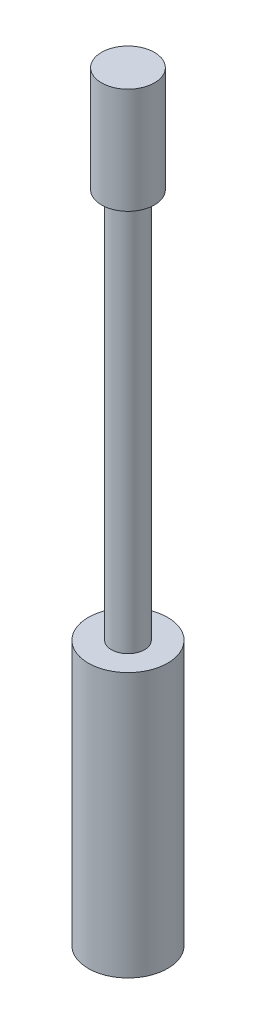
ISO-10303-21;
HEADER;
FILE_DESCRIPTION(('STEP AP214'),'2;1');
FILE_NAME('part.step','',(''),(''),'','','');
FILE_SCHEMA(('AUTOMOTIVE_DESIGN { 1 0 10303 214 1 1 1 1 }'));
ENDSEC;
DATA;
#1=APPLICATION_CONTEXT('core data for automotive mechanical design processes');
#2=APPLICATION_PROTOCOL_DEFINITION('international standard','automotive_design',2000,#1);
#3=PRODUCT_CONTEXT('',#1,'mechanical');
#4=PRODUCT('Part','Part','',(#3));
#5=PRODUCT_RELATED_PRODUCT_CATEGORY('part','',(#4));
#6=PRODUCT_DEFINITION_FORMATION('','',#4);
#7=PRODUCT_DEFINITION_CONTEXT('part definition',#1,'design');
#8=PRODUCT_DEFINITION('design','',#6,#7);
#9=PRODUCT_DEFINITION_SHAPE('','',#8);
#10=(LENGTH_UNIT() NAMED_UNIT(*) SI_UNIT(.MILLI.,.METRE.));
#11=(NAMED_UNIT(*) PLANE_ANGLE_UNIT() SI_UNIT($,.RADIAN.));
#12=(NAMED_UNIT(*) SI_UNIT($,.STERADIAN.) SOLID_ANGLE_UNIT());
#13=UNCERTAINTY_MEASURE_WITH_UNIT(LENGTH_MEASURE(1.E-05),#10,'distance_accuracy_value','');
#14=(GEOMETRIC_REPRESENTATION_CONTEXT(3) GLOBAL_UNCERTAINTY_ASSIGNED_CONTEXT((#13)) GLOBAL_UNIT_ASSIGNED_CONTEXT((#10,
#11,#12)) REPRESENTATION_CONTEXT('',''));
#15=CARTESIAN_POINT('',(0.,0.,0.));
#16=DIRECTION('',(0.,0.,1.));
#17=DIRECTION('',(1.,0.,0.));
#18=AXIS2_PLACEMENT_3D('',#15,#16,#17);
#19=CARTESIAN_POINT('',(0.,40.,0.));
#20=DIRECTION('',(0.,-1.,0.));
#21=DIRECTION('',(0.,0.,-1.));
#22=AXIS2_PLACEMENT_3D('',#19,#20,#21);
#23=CYLINDRICAL_SURFACE('',#22,6.);
#24=CARTESIAN_POINT('',(0.,40.,0.));
#25=DIRECTION('',(0.,1.,0.));
#26=DIRECTION('',(0.,0.,1.));
#27=AXIS2_PLACEMENT_3D('',#24,#25,#26);
#28=CIRCLE('',#27,6.);
#29=CARTESIAN_POINT('',(0.,40.,6.));
#30=VERTEX_POINT('',#29);
#31=EDGE_CURVE('E10',#30,#30,#28,.T.);
#32=ORIENTED_EDGE('',*,*,#31,.F.);
#33=EDGE_LOOP('',(#32));
#34=FACE_BOUND('',#33,.T.);
#35=CARTESIAN_POINT('',(0.,0.,0.));
#36=DIRECTION('',(0.,1.,0.));
#37=DIRECTION('',(0.,0.,1.));
#38=AXIS2_PLACEMENT_3D('',#35,#36,#37);
#39=CIRCLE('',#38,6.);
#40=CARTESIAN_POINT('',(0.,0.,6.));
#41=VERTEX_POINT('',#40);
#42=EDGE_CURVE('E33',#41,#41,#39,.T.);
#43=ORIENTED_EDGE('',*,*,#42,.T.);
#44=EDGE_LOOP('',(#43));
#45=FACE_BOUND('',#44,.T.);
#46=ADVANCED_FACE('F30',(#34,#45),#23,.T.);
#47=CARTESIAN_POINT('',(0.,40.,0.));
#48=DIRECTION('',(0.,1.,0.));
#49=DIRECTION('',(0.,0.,1.));
#50=AXIS2_PLACEMENT_3D('',#47,#48,#49);
#51=PLANE('',#50);
#52=CARTESIAN_POINT('',(0.,40.,0.));
#53=DIRECTION('',(0.,1.,0.));
#54=DIRECTION('',(0.,0.,1.));
#55=AXIS2_PLACEMENT_3D('',#52,#53,#54);
#56=CIRCLE('',#55,2.5);
#57=CARTESIAN_POINT('',(0.,40.,2.5));
#58=VERTEX_POINT('',#57);
#59=EDGE_CURVE('E42',#58,#58,#56,.T.);
#60=ORIENTED_EDGE('',*,*,#59,.F.);
#61=EDGE_LOOP('',(#60));
#62=FACE_BOUND('',#61,.T.);
#63=ORIENTED_EDGE('',*,*,#31,.T.);
#64=EDGE_LOOP('',(#63));
#65=FACE_BOUND('',#64,.T.);
#66=ADVANCED_FACE('F72',(#62,#65),#51,.T.);
#67=CARTESIAN_POINT('',(0.,0.,0.));
#68=DIRECTION('',(0.,1.,0.));
#69=DIRECTION('',(0.,0.,1.));
#70=AXIS2_PLACEMENT_3D('',#67,#68,#69);
#71=PLANE('',#70);
#72=ORIENTED_EDGE('',*,*,#42,.F.);
#73=EDGE_LOOP('',(#72));
#74=FACE_BOUND('',#73,.T.);
#75=ADVANCED_FACE('F77',(#74),#71,.F.);
#76=CARTESIAN_POINT('',(0.,99.,0.));
#77=DIRECTION('',(0.,-1.,0.));
#78=DIRECTION('',(0.,0.,-1.));
#79=AXIS2_PLACEMENT_3D('',#76,#77,#78);
#80=CYLINDRICAL_SURFACE('',#79,2.5);
#81=CARTESIAN_POINT('',(0.,99.,0.));
#82=DIRECTION('',(0.,1.,0.));
#83=DIRECTION('',(0.,0.,1.));
#84=AXIS2_PLACEMENT_3D('',#81,#82,#83);
#85=CIRCLE('',#84,2.5);
#86=CARTESIAN_POINT('',(0.,99.,2.5));
#87=VERTEX_POINT('',#86);
#88=EDGE_CURVE('E40',#87,#87,#85,.T.);
#89=ORIENTED_EDGE('',*,*,#88,.F.);
#90=EDGE_LOOP('',(#89));
#91=FACE_BOUND('',#90,.T.);
#92=ORIENTED_EDGE('',*,*,#59,.T.);
#93=EDGE_LOOP('',(#92));
#94=FACE_BOUND('',#93,.T.);
#95=ADVANCED_FACE('F59',(#91,#94),#80,.T.);
#96=CARTESIAN_POINT('',(0.,115.,0.));
#97=DIRECTION('',(0.,-1.,0.));
#98=DIRECTION('',(0.,0.,-1.));
#99=AXIS2_PLACEMENT_3D('',#96,#97,#98);
#100=CYLINDRICAL_SURFACE('',#99,4.);
#101=CARTESIAN_POINT('',(0.,115.,0.));
#102=DIRECTION('',(0.,1.,0.));
#103=DIRECTION('',(0.,0.,1.));
#104=AXIS2_PLACEMENT_3D('',#101,#102,#103);
#105=CIRCLE('',#104,4.);
#106=CARTESIAN_POINT('',(0.,115.,4.));
#107=VERTEX_POINT('',#106);
#108=EDGE_CURVE('E45',#107,#107,#105,.T.);
#109=ORIENTED_EDGE('',*,*,#108,.F.);
#110=EDGE_LOOP('',(#109));
#111=FACE_BOUND('',#110,.T.);
#112=CARTESIAN_POINT('',(0.,99.,0.));
#113=DIRECTION('',(0.,1.,0.));
#114=DIRECTION('',(0.,0.,1.));
#115=AXIS2_PLACEMENT_3D('',#112,#113,#114);
#116=CIRCLE('',#115,4.);
#117=CARTESIAN_POINT('',(0.,99.,4.));
#118=VERTEX_POINT('',#117);
#119=EDGE_CURVE('E48',#118,#118,#116,.T.);
#120=ORIENTED_EDGE('',*,*,#119,.T.);
#121=EDGE_LOOP('',(#120));
#122=FACE_BOUND('',#121,.T.);
#123=ADVANCED_FACE('F56',(#111,#122),#100,.T.);
#124=CARTESIAN_POINT('',(0.,115.,0.));
#125=DIRECTION('',(0.,1.,0.));
#126=DIRECTION('',(0.,0.,1.));
#127=AXIS2_PLACEMENT_3D('',#124,#125,#126);
#128=PLANE('',#127);
#129=ORIENTED_EDGE('',*,*,#108,.T.);
#130=EDGE_LOOP('',(#129));
#131=FACE_BOUND('',#130,.T.);
#132=ADVANCED_FACE('F54',(#131),#128,.T.);
#133=CARTESIAN_POINT('',(0.,99.,0.));
#134=DIRECTION('',(0.,1.,0.));
#135=DIRECTION('',(0.,0.,1.));
#136=AXIS2_PLACEMENT_3D('',#133,#134,#135);
#137=PLANE('',#136);
#138=ORIENTED_EDGE('',*,*,#88,.T.);
#139=EDGE_LOOP('',(#138));
#140=FACE_BOUND('',#139,.T.);
#141=ORIENTED_EDGE('',*,*,#119,.F.);
#142=EDGE_LOOP('',(#141));
#143=FACE_BOUND('',#142,.T.);
#144=ADVANCED_FACE('F63',(#140,#143),#137,.F.);
#145=CLOSED_SHELL('',(#46,#66,#75,#95,#123,#132,#144));
#146=MANIFOLD_SOLID_BREP('B2',#145);
#147=ADVANCED_BREP_SHAPE_REPRESENTATION('',(#18,#146),#14);
#148=SHAPE_DEFINITION_REPRESENTATION(#9,#147);
ENDSEC;
END-ISO-10303-21;
